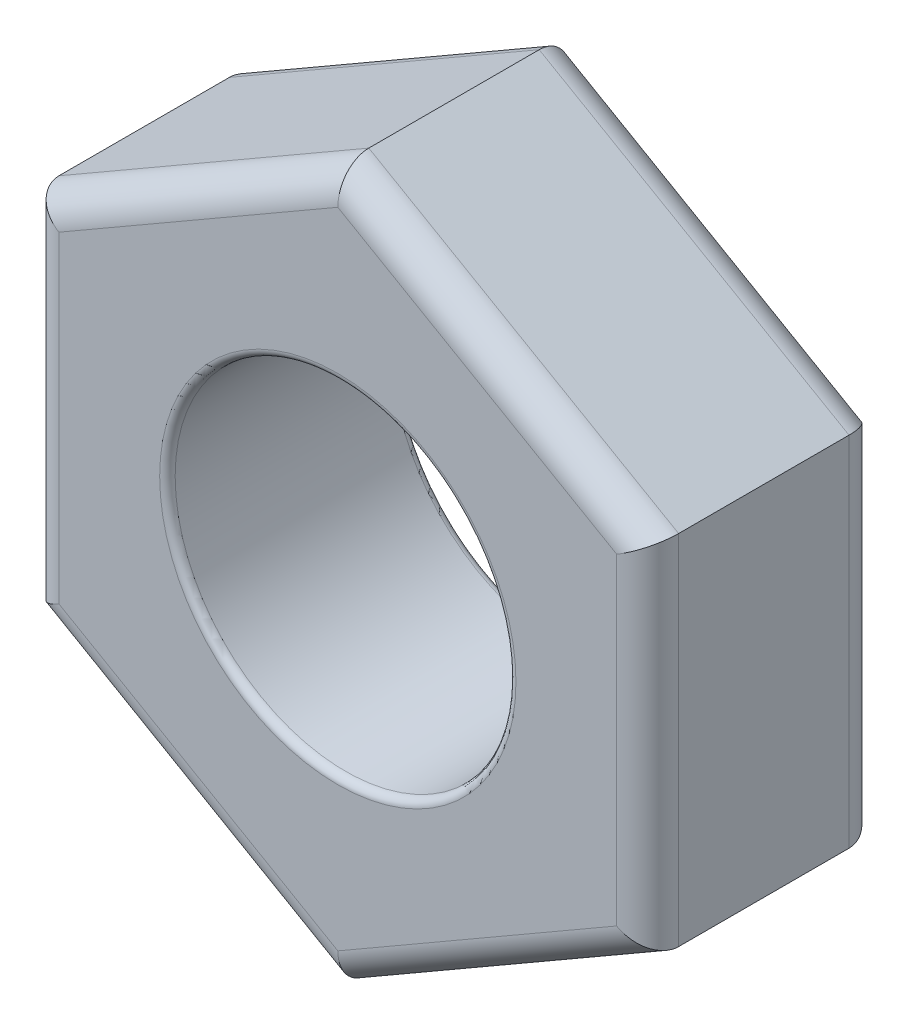
ISO-10303-21;
HEADER;
FILE_DESCRIPTION(('STEP AP214'),'2;1');
FILE_NAME('part.step','',(''),(''),'','','');
FILE_SCHEMA(('AUTOMOTIVE_DESIGN { 1 0 10303 214 1 1 1 1 }'));
ENDSEC;
DATA;
#1=APPLICATION_CONTEXT('core data for automotive mechanical design processes');
#2=APPLICATION_PROTOCOL_DEFINITION('international standard','automotive_design',2000,#1);
#3=PRODUCT_CONTEXT('',#1,'mechanical');
#4=PRODUCT('Part','Part','',(#3));
#5=PRODUCT_RELATED_PRODUCT_CATEGORY('part','',(#4));
#6=PRODUCT_DEFINITION_FORMATION('','',#4);
#7=PRODUCT_DEFINITION_CONTEXT('part definition',#1,'design');
#8=PRODUCT_DEFINITION('design','',#6,#7);
#9=PRODUCT_DEFINITION_SHAPE('','',#8);
#10=(LENGTH_UNIT() NAMED_UNIT(*) SI_UNIT(.MILLI.,.METRE.));
#11=(NAMED_UNIT(*) PLANE_ANGLE_UNIT() SI_UNIT($,.RADIAN.));
#12=(NAMED_UNIT(*) SI_UNIT($,.STERADIAN.) SOLID_ANGLE_UNIT());
#13=UNCERTAINTY_MEASURE_WITH_UNIT(LENGTH_MEASURE(1.E-05),#10,'distance_accuracy_value','');
#14=(GEOMETRIC_REPRESENTATION_CONTEXT(3) GLOBAL_UNCERTAINTY_ASSIGNED_CONTEXT((#13)) GLOBAL_UNIT_ASSIGNED_CONTEXT((#10,
#11,#12)) REPRESENTATION_CONTEXT('',''));
#15=CARTESIAN_POINT('',(0.,0.,0.));
#16=DIRECTION('',(0.,0.,1.));
#17=DIRECTION('',(1.,0.,0.));
#18=AXIS2_PLACEMENT_3D('',#15,#16,#17);
#19=CARTESIAN_POINT('',(0.,0.,15.));
#20=DIRECTION('',(0.,0.,1.));
#21=DIRECTION('',(1.,0.,0.));
#22=AXIS2_PLACEMENT_3D('',#19,#20,#21);
#23=PLANE('',#22);
#24=CARTESIAN_POINT('',(0.,0.,15.));
#25=DIRECTION('',(0.,0.,1.));
#26=DIRECTION('',(1.,0.,0.));
#27=AXIS2_PLACEMENT_3D('',#24,#25,#26);
#28=CIRCLE('',#27,11.5);
#29=CARTESIAN_POINT('',(11.5,0.,15.));
#30=VERTEX_POINT('',#29);
#31=EDGE_CURVE('E11',#30,#30,#28,.F.);
#32=ORIENTED_EDGE('',*,*,#31,.T.);
#33=EDGE_LOOP('',(#32));
#34=FACE_BOUND('',#33,.T.);
#35=DIRECTION('',(0.866025403784439,0.5,0.));
#36=VECTOR('',#35,1.);
#37=CARTESIAN_POINT('',(19.,-9.81495457622363,15.));
#38=LINE('',#37,#36);
#39=CARTESIAN_POINT('',(0.,-20.7846096908265,15.));
#40=VERTEX_POINT('',#39);
#41=CARTESIAN_POINT('',(18.,-10.3923048454133,15.));
#42=VERTEX_POINT('',#41);
#43=EDGE_CURVE('E49',#40,#42,#38,.T.);
#44=ORIENTED_EDGE('',*,*,#43,.T.);
#45=DIRECTION('',(0.,1.,0.));
#46=VECTOR('',#45,1.);
#47=CARTESIAN_POINT('',(18.,11.5470053837925,15.));
#48=LINE('',#47,#46);
#49=CARTESIAN_POINT('',(18.,10.3923048454133,15.));
#50=VERTEX_POINT('',#49);
#51=EDGE_CURVE('E129',#42,#50,#48,.T.);
#52=ORIENTED_EDGE('',*,*,#51,.T.);
#53=DIRECTION('',(-0.866025403784438,0.5,0.));
#54=VECTOR('',#53,1.);
#55=CARTESIAN_POINT('',(-0.999999999999987,21.3619599600162,15.));
#56=LINE('',#55,#54);
#57=CARTESIAN_POINT('',(0.,20.7846096908265,15.));
#58=VERTEX_POINT('',#57);
#59=EDGE_CURVE('E194',#50,#58,#56,.T.);
#60=ORIENTED_EDGE('',*,*,#59,.T.);
#61=DIRECTION('',(-0.866025403784439,-0.5,0.));
#62=VECTOR('',#61,1.);
#63=CARTESIAN_POINT('',(-19.,9.81495457622363,15.));
#64=LINE('',#63,#62);
#65=CARTESIAN_POINT('',(-18.,10.3923048454133,15.));
#66=VERTEX_POINT('',#65);
#67=EDGE_CURVE('E196',#58,#66,#64,.T.);
#68=ORIENTED_EDGE('',*,*,#67,.T.);
#69=DIRECTION('',(0.,-1.,0.));
#70=VECTOR('',#69,1.);
#71=CARTESIAN_POINT('',(-18.,-11.5470053837925,15.));
#72=LINE('',#71,#70);
#73=CARTESIAN_POINT('',(-18.,-10.3923048454133,15.));
#74=VERTEX_POINT('',#73);
#75=EDGE_CURVE('E198',#66,#74,#72,.T.);
#76=ORIENTED_EDGE('',*,*,#75,.T.);
#77=DIRECTION('',(0.866025403784439,-0.5,0.));
#78=VECTOR('',#77,1.);
#79=CARTESIAN_POINT('',(0.999999999999984,-21.3619599600162,15.));
#80=LINE('',#79,#78);
#81=EDGE_CURVE('E54',#74,#40,#80,.T.);
#82=ORIENTED_EDGE('',*,*,#81,.T.);
#83=EDGE_LOOP('',(#44,#52,#60,#68,#76,#82));
#84=FACE_BOUND('',#83,.T.);
#85=ADVANCED_FACE('F34',(#34,#84),#23,.T.);
#86=CARTESIAN_POINT('',(0.,0.,0.));
#87=DIRECTION('',(0.,0.,1.));
#88=DIRECTION('',(1.,0.,0.));
#89=AXIS2_PLACEMENT_3D('',#86,#87,#88);
#90=PLANE('',#89);
#91=CARTESIAN_POINT('',(0.,0.,0.));
#92=DIRECTION('',(0.,0.,1.));
#93=DIRECTION('',(1.,0.,0.));
#94=AXIS2_PLACEMENT_3D('',#91,#92,#93);
#95=CIRCLE('',#94,11.5);
#96=CARTESIAN_POINT('',(11.5,0.,0.));
#97=VERTEX_POINT('',#96);
#98=EDGE_CURVE('E203',#97,#97,#95,.T.);
#99=ORIENTED_EDGE('',*,*,#98,.T.);
#100=EDGE_LOOP('',(#99));
#101=FACE_BOUND('',#100,.T.);
#102=DIRECTION('',(0.,1.,0.));
#103=VECTOR('',#102,1.);
#104=CARTESIAN_POINT('',(18.,0.,0.));
#105=LINE('',#104,#103);
#106=CARTESIAN_POINT('',(18.,10.3923048454133,0.));
#107=VERTEX_POINT('',#106);
#108=CARTESIAN_POINT('',(18.,-10.3923048454133,0.));
#109=VERTEX_POINT('',#108);
#110=EDGE_CURVE('E165',#107,#109,#105,.F.);
#111=ORIENTED_EDGE('',*,*,#110,.T.);
#112=DIRECTION('',(0.866025403784439,0.5,0.));
#113=VECTOR('',#112,1.);
#114=CARTESIAN_POINT('',(9.00000000000001,-15.5884572681199,0.));
#115=LINE('',#114,#113);
#116=CARTESIAN_POINT('',(0.,-20.7846096908265,0.));
#117=VERTEX_POINT('',#116);
#118=EDGE_CURVE('E175',#109,#117,#115,.F.);
#119=ORIENTED_EDGE('',*,*,#118,.T.);
#120=DIRECTION('',(0.866025403784439,-0.5,0.));
#121=VECTOR('',#120,1.);
#122=CARTESIAN_POINT('',(-9.00000000000001,-15.5884572681199,0.));
#123=LINE('',#122,#121);
#124=CARTESIAN_POINT('',(-18.,-10.3923048454133,0.));
#125=VERTEX_POINT('',#124);
#126=EDGE_CURVE('E173',#117,#125,#123,.F.);
#127=ORIENTED_EDGE('',*,*,#126,.T.);
#128=DIRECTION('',(0.,-1.,0.));
#129=VECTOR('',#128,1.);
#130=CARTESIAN_POINT('',(-18.,0.,0.));
#131=LINE('',#130,#129);
#132=CARTESIAN_POINT('',(-18.,10.3923048454133,0.));
#133=VERTEX_POINT('',#132);
#134=EDGE_CURVE('E171',#125,#133,#131,.F.);
#135=ORIENTED_EDGE('',*,*,#134,.T.);
#136=DIRECTION('',(-0.866025403784439,-0.5,0.));
#137=VECTOR('',#136,1.);
#138=CARTESIAN_POINT('',(-9.00000000000001,15.5884572681199,0.));
#139=LINE('',#138,#137);
#140=CARTESIAN_POINT('',(0.,20.7846096908265,0.));
#141=VERTEX_POINT('',#140);
#142=EDGE_CURVE('E169',#133,#141,#139,.F.);
#143=ORIENTED_EDGE('',*,*,#142,.T.);
#144=DIRECTION('',(-0.866025403784438,0.5,0.));
#145=VECTOR('',#144,1.);
#146=CARTESIAN_POINT('',(9.00000000000001,15.5884572681199,0.));
#147=LINE('',#146,#145);
#148=EDGE_CURVE('E167',#141,#107,#147,.F.);
#149=ORIENTED_EDGE('',*,*,#148,.T.);
#150=EDGE_LOOP('',(#111,#119,#127,#135,#143,#149));
#151=FACE_BOUND('',#150,.T.);
#152=ADVANCED_FACE('F246',(#101,#151),#90,.F.);
#153=CARTESIAN_POINT('',(-20.,-11.5470053837925,15.));
#154=DIRECTION('',(0.5,0.866025403784439,0.));
#155=DIRECTION('',(-0.866025403784439,0.5,0.));
#156=AXIS2_PLACEMENT_3D('',#153,#154,#155);
#157=PLANE('',#156);
#158=DIRECTION('',(0.,0.,-1.));
#159=VECTOR('',#158,1.);
#160=CARTESIAN_POINT('',(-20.,-11.5470053837925,15.));
#161=LINE('',#160,#159);
#162=CARTESIAN_POINT('',(-20.,-11.5470053837925,13.));
#163=VERTEX_POINT('',#162);
#164=CARTESIAN_POINT('',(-20.,-11.5470053837925,2.));
#165=VERTEX_POINT('',#164);
#166=EDGE_CURVE('E221',#163,#165,#161,.T.);
#167=ORIENTED_EDGE('',*,*,#166,.T.);
#168=DIRECTION('',(0.866025403784439,-0.5,0.));
#169=VECTOR('',#168,1.);
#170=CARTESIAN_POINT('',(-20.,-11.5470053837925,2.));
#171=LINE('',#170,#169);
#172=CARTESIAN_POINT('',(0.,-23.094010767585,2.));
#173=VERTEX_POINT('',#172);
#174=EDGE_CURVE('E180',#165,#173,#171,.T.);
#175=ORIENTED_EDGE('',*,*,#174,.T.);
#176=DIRECTION('',(0.,0.,-1.));
#177=VECTOR('',#176,1.);
#178=CARTESIAN_POINT('',(0.,-23.094010767585,15.));
#179=LINE('',#178,#177);
#180=CARTESIAN_POINT('',(0.,-23.094010767585,13.));
#181=VERTEX_POINT('',#180);
#182=EDGE_CURVE('E143',#181,#173,#179,.T.);
#183=ORIENTED_EDGE('',*,*,#182,.F.);
#184=DIRECTION('',(0.866025403784439,-0.5,0.));
#185=VECTOR('',#184,1.);
#186=CARTESIAN_POINT('',(-20.,-11.5470053837925,13.));
#187=LINE('',#186,#185);
#188=EDGE_CURVE('E178',#181,#163,#187,.F.);
#189=ORIENTED_EDGE('',*,*,#188,.T.);
#190=EDGE_LOOP('',(#167,#175,#183,#189));
#191=FACE_BOUND('',#190,.T.);
#192=ADVANCED_FACE('F249',(#191),#157,.F.);
#193=CARTESIAN_POINT('',(0.,-23.094010767585,15.));
#194=DIRECTION('',(-0.5,0.866025403784438,0.));
#195=DIRECTION('',(-0.866025403784439,-0.5,0.));
#196=AXIS2_PLACEMENT_3D('',#193,#194,#195);
#197=PLANE('',#196);
#198=ORIENTED_EDGE('',*,*,#182,.T.);
#199=DIRECTION('',(0.866025403784439,0.5,0.));
#200=VECTOR('',#199,1.);
#201=CARTESIAN_POINT('',(0.,-23.094010767585,2.));
#202=LINE('',#201,#200);
#203=CARTESIAN_POINT('',(20.,-11.5470053837925,2.));
#204=VERTEX_POINT('',#203);
#205=EDGE_CURVE('E142',#173,#204,#202,.T.);
#206=ORIENTED_EDGE('',*,*,#205,.T.);
#207=DIRECTION('',(0.,0.,-1.));
#208=VECTOR('',#207,1.);
#209=CARTESIAN_POINT('',(20.,-11.5470053837925,15.));
#210=LINE('',#209,#208);
#211=CARTESIAN_POINT('',(20.,-11.5470053837925,13.));
#212=VERTEX_POINT('',#211);
#213=EDGE_CURVE('E149',#212,#204,#210,.T.);
#214=ORIENTED_EDGE('',*,*,#213,.F.);
#215=DIRECTION('',(0.866025403784439,0.5,0.));
#216=VECTOR('',#215,1.);
#217=CARTESIAN_POINT('',(0.,-23.094010767585,13.));
#218=LINE('',#217,#216);
#219=EDGE_CURVE('E135',#212,#181,#218,.F.);
#220=ORIENTED_EDGE('',*,*,#219,.T.);
#221=EDGE_LOOP('',(#198,#206,#214,#220));
#222=FACE_BOUND('',#221,.T.);
#223=ADVANCED_FACE('F156',(#222),#197,.F.);
#224=CARTESIAN_POINT('',(20.,-11.5470053837925,15.));
#225=DIRECTION('',(-1.,0.,0.));
#226=DIRECTION('',(0.,-1.,0.));
#227=AXIS2_PLACEMENT_3D('',#224,#225,#226);
#228=PLANE('',#227);
#229=ORIENTED_EDGE('',*,*,#213,.T.);
#230=DIRECTION('',(0.,1.,0.));
#231=VECTOR('',#230,1.);
#232=CARTESIAN_POINT('',(20.,-11.5470053837925,2.));
#233=LINE('',#232,#231);
#234=CARTESIAN_POINT('',(20.,11.5470053837925,2.));
#235=VERTEX_POINT('',#234);
#236=EDGE_CURVE('E152',#204,#235,#233,.T.);
#237=ORIENTED_EDGE('',*,*,#236,.T.);
#238=DIRECTION('',(0.,0.,-1.));
#239=VECTOR('',#238,1.);
#240=CARTESIAN_POINT('',(20.,11.5470053837925,15.));
#241=LINE('',#240,#239);
#242=CARTESIAN_POINT('',(20.,11.5470053837925,13.));
#243=VERTEX_POINT('',#242);
#244=EDGE_CURVE('E151',#243,#235,#241,.T.);
#245=ORIENTED_EDGE('',*,*,#244,.F.);
#246=DIRECTION('',(0.,1.,0.));
#247=VECTOR('',#246,1.);
#248=CARTESIAN_POINT('',(20.,-11.5470053837925,13.));
#249=LINE('',#248,#247);
#250=EDGE_CURVE('E127',#243,#212,#249,.F.);
#251=ORIENTED_EDGE('',*,*,#250,.T.);
#252=EDGE_LOOP('',(#229,#237,#245,#251));
#253=FACE_BOUND('',#252,.T.);
#254=ADVANCED_FACE('F148',(#253),#228,.F.);
#255=CARTESIAN_POINT('',(20.,11.5470053837925,15.));
#256=DIRECTION('',(-0.5,-0.866025403784438,0.));
#257=DIRECTION('',(0.866025403784438,-0.5,0.));
#258=AXIS2_PLACEMENT_3D('',#255,#256,#257);
#259=PLANE('',#258);
#260=ORIENTED_EDGE('',*,*,#244,.T.);
#261=DIRECTION('',(-0.866025403784438,0.5,0.));
#262=VECTOR('',#261,1.);
#263=CARTESIAN_POINT('',(20.,11.5470053837925,2.));
#264=LINE('',#263,#262);
#265=CARTESIAN_POINT('',(0.,23.0940107675851,2.));
#266=VERTEX_POINT('',#265);
#267=EDGE_CURVE('E153',#235,#266,#264,.T.);
#268=ORIENTED_EDGE('',*,*,#267,.T.);
#269=DIRECTION('',(0.,0.,-1.));
#270=VECTOR('',#269,1.);
#271=CARTESIAN_POINT('',(0.,23.0940107675851,15.));
#272=LINE('',#271,#270);
#273=CARTESIAN_POINT('',(0.,23.0940107675851,13.));
#274=VERTEX_POINT('',#273);
#275=EDGE_CURVE('E160',#274,#266,#272,.T.);
#276=ORIENTED_EDGE('',*,*,#275,.F.);
#277=DIRECTION('',(-0.866025403784438,0.5,0.));
#278=VECTOR('',#277,1.);
#279=CARTESIAN_POINT('',(20.,11.5470053837925,13.));
#280=LINE('',#279,#278);
#281=EDGE_CURVE('E190',#274,#243,#280,.F.);
#282=ORIENTED_EDGE('',*,*,#281,.T.);
#283=EDGE_LOOP('',(#260,#268,#276,#282));
#284=FACE_BOUND('',#283,.T.);
#285=ADVANCED_FACE('F265',(#284),#259,.F.);
#286=CARTESIAN_POINT('',(0.,23.0940107675851,15.));
#287=DIRECTION('',(0.5,-0.866025403784439,0.));
#288=DIRECTION('',(0.866025403784439,0.5,0.));
#289=AXIS2_PLACEMENT_3D('',#286,#287,#288);
#290=PLANE('',#289);
#291=ORIENTED_EDGE('',*,*,#275,.T.);
#292=DIRECTION('',(-0.866025403784439,-0.5,0.));
#293=VECTOR('',#292,1.);
#294=CARTESIAN_POINT('',(0.,23.0940107675851,2.));
#295=LINE('',#294,#293);
#296=CARTESIAN_POINT('',(-20.,11.5470053837925,2.));
#297=VERTEX_POINT('',#296);
#298=EDGE_CURVE('E188',#266,#297,#295,.T.);
#299=ORIENTED_EDGE('',*,*,#298,.T.);
#300=DIRECTION('',(0.,0.,-1.));
#301=VECTOR('',#300,1.);
#302=CARTESIAN_POINT('',(-20.,11.5470053837925,15.));
#303=LINE('',#302,#301);
#304=CARTESIAN_POINT('',(-20.,11.5470053837925,13.));
#305=VERTEX_POINT('',#304);
#306=EDGE_CURVE('E282',#305,#297,#303,.T.);
#307=ORIENTED_EDGE('',*,*,#306,.F.);
#308=DIRECTION('',(-0.866025403784439,-0.5,0.));
#309=VECTOR('',#308,1.);
#310=CARTESIAN_POINT('',(0.,23.0940107675851,13.));
#311=LINE('',#310,#309);
#312=EDGE_CURVE('E186',#305,#274,#311,.F.);
#313=ORIENTED_EDGE('',*,*,#312,.T.);
#314=EDGE_LOOP('',(#291,#299,#307,#313));
#315=FACE_BOUND('',#314,.T.);
#316=ADVANCED_FACE('F281',(#315),#290,.F.);
#317=CARTESIAN_POINT('',(-20.,11.5470053837925,15.));
#318=DIRECTION('',(1.,0.,0.));
#319=DIRECTION('',(0.,0.,-1.));
#320=AXIS2_PLACEMENT_3D('',#317,#318,#319);
#321=PLANE('',#320);
#322=ORIENTED_EDGE('',*,*,#306,.T.);
#323=DIRECTION('',(0.,-1.,0.));
#324=VECTOR('',#323,1.);
#325=CARTESIAN_POINT('',(-20.,11.5470053837925,2.));
#326=LINE('',#325,#324);
#327=EDGE_CURVE('E184',#297,#165,#326,.T.);
#328=ORIENTED_EDGE('',*,*,#327,.T.);
#329=ORIENTED_EDGE('',*,*,#166,.F.);
#330=DIRECTION('',(0.,-1.,0.));
#331=VECTOR('',#330,1.);
#332=CARTESIAN_POINT('',(-20.,11.5470053837925,13.));
#333=LINE('',#332,#331);
#334=EDGE_CURVE('E182',#163,#305,#333,.F.);
#335=ORIENTED_EDGE('',*,*,#334,.T.);
#336=EDGE_LOOP('',(#322,#328,#329,#335));
#337=FACE_BOUND('',#336,.T.);
#338=ADVANCED_FACE('F285',(#337),#321,.F.);
#339=CARTESIAN_POINT('',(0.,0.,15.));
#340=DIRECTION('',(0.,0.,-1.));
#341=DIRECTION('',(-1.,0.,0.));
#342=AXIS2_PLACEMENT_3D('',#339,#340,#341);
#343=CYLINDRICAL_SURFACE('',#342,11.);
#344=CARTESIAN_POINT('',(0.,0.,0.5));
#345=DIRECTION('',(0.,0.,1.));
#346=DIRECTION('',(1.,0.,0.));
#347=AXIS2_PLACEMENT_3D('',#344,#345,#346);
#348=CIRCLE('',#347,11.);
#349=CARTESIAN_POINT('',(11.,0.,0.5));
#350=VERTEX_POINT('',#349);
#351=EDGE_CURVE('E42',#350,#350,#348,.F.);
#352=ORIENTED_EDGE('',*,*,#351,.T.);
#353=EDGE_LOOP('',(#352));
#354=FACE_BOUND('',#353,.T.);
#355=CARTESIAN_POINT('',(0.,0.,14.5));
#356=DIRECTION('',(0.,0.,1.));
#357=DIRECTION('',(1.,0.,0.));
#358=AXIS2_PLACEMENT_3D('',#355,#356,#357);
#359=CIRCLE('',#358,11.);
#360=CARTESIAN_POINT('',(11.,0.,14.5));
#361=VERTEX_POINT('',#360);
#362=EDGE_CURVE('E233',#361,#361,#359,.T.);
#363=ORIENTED_EDGE('',*,*,#362,.T.);
#364=EDGE_LOOP('',(#363));
#365=FACE_BOUND('',#364,.T.);
#366=ADVANCED_FACE('F238',(#354,#365),#343,.F.);
#367=CARTESIAN_POINT('',(1.00000000000001,21.3619599600162,2.));
#368=DIRECTION('',(-0.866025403784439,-0.5,0.));
#369=DIRECTION('',(0.5,-0.866025403784439,0.));
#370=AXIS2_PLACEMENT_3D('',#367,#368,#369);
#371=CYLINDRICAL_SURFACE('',#370,2.);
#372=CARTESIAN_POINT('',(0.,20.7846096908265,2.));
#373=DIRECTION('',(-1.,0.,0.));
#374=DIRECTION('',(0.,1.,0.));
#375=AXIS2_PLACEMENT_3D('',#372,#373,#374);
#376=ELLIPSE('',#375,2.3094010767585,2.);
#377=EDGE_CURVE('E215',#141,#266,#376,.F.);
#378=ORIENTED_EDGE('',*,*,#377,.F.);
#379=ORIENTED_EDGE('',*,*,#142,.F.);
#380=CARTESIAN_POINT('',(-18.,10.3923048454133,2.));
#381=DIRECTION('',(-0.5,-0.866025403784439,0.));
#382=DIRECTION('',(-0.866025403784439,0.5,0.));
#383=AXIS2_PLACEMENT_3D('',#380,#381,#382);
#384=ELLIPSE('',#383,2.3094010767585,2.);
#385=EDGE_CURVE('E218',#297,#133,#384,.T.);
#386=ORIENTED_EDGE('',*,*,#385,.F.);
#387=ORIENTED_EDGE('',*,*,#298,.F.);
#388=EDGE_LOOP('',(#378,#379,#386,#387));
#389=FACE_BOUND('',#388,.T.);
#390=ADVANCED_FACE('F275',(#389),#371,.T.);
#391=CARTESIAN_POINT('',(-18.,11.5470053837925,2.));
#392=DIRECTION('',(0.,-1.,0.));
#393=DIRECTION('',(0.,0.,-1.));
#394=AXIS2_PLACEMENT_3D('',#391,#392,#393);
#395=CYLINDRICAL_SURFACE('',#394,2.);
#396=ORIENTED_EDGE('',*,*,#385,.T.);
#397=ORIENTED_EDGE('',*,*,#134,.F.);
#398=CARTESIAN_POINT('',(-18.,-10.3923048454133,2.));
#399=DIRECTION('',(0.5,-0.866025403784439,0.));
#400=DIRECTION('',(-0.866025403784439,-0.5,0.));
#401=AXIS2_PLACEMENT_3D('',#398,#399,#400);
#402=ELLIPSE('',#401,2.3094010767585,2.);
#403=EDGE_CURVE('E212',#165,#125,#402,.T.);
#404=ORIENTED_EDGE('',*,*,#403,.F.);
#405=ORIENTED_EDGE('',*,*,#327,.F.);
#406=EDGE_LOOP('',(#396,#397,#404,#405));
#407=FACE_BOUND('',#406,.T.);
#408=ADVANCED_FACE('F297',(#407),#395,.T.);
#409=CARTESIAN_POINT('',(19.,9.81495457622366,2.));
#410=DIRECTION('',(-0.866025403784438,0.5,0.));
#411=DIRECTION('',(-0.5,-0.866025403784438,0.));
#412=AXIS2_PLACEMENT_3D('',#409,#410,#411);
#413=CYLINDRICAL_SURFACE('',#412,2.);
#414=ORIENTED_EDGE('',*,*,#377,.T.);
#415=ORIENTED_EDGE('',*,*,#267,.F.);
#416=CARTESIAN_POINT('',(18.,10.3923048454133,2.));
#417=DIRECTION('',(-0.5,0.866025403784439,0.));
#418=DIRECTION('',(0.866025403784439,0.5,0.));
#419=AXIS2_PLACEMENT_3D('',#416,#417,#418);
#420=ELLIPSE('',#419,2.3094010767585,2.);
#421=EDGE_CURVE('E209',#107,#235,#420,.F.);
#422=ORIENTED_EDGE('',*,*,#421,.F.);
#423=ORIENTED_EDGE('',*,*,#148,.F.);
#424=EDGE_LOOP('',(#414,#415,#422,#423));
#425=FACE_BOUND('',#424,.T.);
#426=ADVANCED_FACE('F270',(#425),#413,.T.);
#427=CARTESIAN_POINT('',(-19.,-9.81495457622364,2.));
#428=DIRECTION('',(0.866025403784439,-0.5,0.));
#429=DIRECTION('',(0.5,0.866025403784439,0.));
#430=AXIS2_PLACEMENT_3D('',#427,#428,#429);
#431=CYLINDRICAL_SURFACE('',#430,2.);
#432=ORIENTED_EDGE('',*,*,#403,.T.);
#433=ORIENTED_EDGE('',*,*,#126,.F.);
#434=CARTESIAN_POINT('',(0.,-20.7846096908265,2.));
#435=DIRECTION('',(1.,0.,0.));
#436=DIRECTION('',(0.,-1.,0.));
#437=AXIS2_PLACEMENT_3D('',#434,#435,#436);
#438=ELLIPSE('',#437,2.3094010767585,2.);
#439=EDGE_CURVE('E206',#173,#117,#438,.T.);
#440=ORIENTED_EDGE('',*,*,#439,.F.);
#441=ORIENTED_EDGE('',*,*,#174,.F.);
#442=EDGE_LOOP('',(#432,#433,#440,#441));
#443=FACE_BOUND('',#442,.T.);
#444=ADVANCED_FACE('F299',(#443),#431,.T.);
#445=CARTESIAN_POINT('',(18.,-11.5470053837925,2.));
#446=DIRECTION('',(0.,1.,0.));
#447=DIRECTION('',(-1.,0.,0.));
#448=AXIS2_PLACEMENT_3D('',#445,#446,#447);
#449=CYLINDRICAL_SURFACE('',#448,2.);
#450=ORIENTED_EDGE('',*,*,#421,.T.);
#451=ORIENTED_EDGE('',*,*,#236,.F.);
#452=CARTESIAN_POINT('',(18.,-10.3923048454133,2.));
#453=DIRECTION('',(0.5,0.866025403784439,0.));
#454=DIRECTION('',(-0.866025403784439,0.5,0.));
#455=AXIS2_PLACEMENT_3D('',#452,#453,#454);
#456=ELLIPSE('',#455,2.3094010767585,2.);
#457=EDGE_CURVE('E204',#109,#204,#456,.F.);
#458=ORIENTED_EDGE('',*,*,#457,.F.);
#459=ORIENTED_EDGE('',*,*,#110,.F.);
#460=EDGE_LOOP('',(#450,#451,#458,#459));
#461=FACE_BOUND('',#460,.T.);
#462=ADVANCED_FACE('F262',(#461),#449,.T.);
#463=CARTESIAN_POINT('',(-1.00000000000002,-21.3619599600162,2.));
#464=DIRECTION('',(0.866025403784439,0.5,0.));
#465=DIRECTION('',(-0.5,0.866025403784438,0.));
#466=AXIS2_PLACEMENT_3D('',#463,#464,#465);
#467=CYLINDRICAL_SURFACE('',#466,2.);
#468=ORIENTED_EDGE('',*,*,#439,.T.);
#469=ORIENTED_EDGE('',*,*,#118,.F.);
#470=ORIENTED_EDGE('',*,*,#457,.T.);
#471=ORIENTED_EDGE('',*,*,#205,.F.);
#472=EDGE_LOOP('',(#468,#469,#470,#471));
#473=FACE_BOUND('',#472,.T.);
#474=ADVANCED_FACE('F258',(#473),#467,.T.);
#475=CARTESIAN_POINT('',(-18.,0.,13.));
#476=DIRECTION('',(0.,1.,0.));
#477=DIRECTION('',(0.,0.,1.));
#478=AXIS2_PLACEMENT_3D('',#475,#476,#477);
#479=CYLINDRICAL_SURFACE('',#478,2.);
#480=CARTESIAN_POINT('',(-18.,10.3923048454133,13.));
#481=DIRECTION('',(0.5,0.866025403784439,0.));
#482=DIRECTION('',(0.866025403784439,-0.5,0.));
#483=AXIS2_PLACEMENT_3D('',#480,#481,#482);
#484=ELLIPSE('',#483,2.3094010767585,2.);
#485=EDGE_CURVE('E226',#305,#66,#484,.T.);
#486=ORIENTED_EDGE('',*,*,#485,.F.);
#487=ORIENTED_EDGE('',*,*,#334,.F.);
#488=CARTESIAN_POINT('',(-18.,-10.3923048454133,13.));
#489=DIRECTION('',(-0.5,0.866025403784439,0.));
#490=DIRECTION('',(0.866025403784439,0.5,0.));
#491=AXIS2_PLACEMENT_3D('',#488,#489,#490);
#492=ELLIPSE('',#491,2.3094010767585,2.);
#493=EDGE_CURVE('E207',#74,#163,#492,.F.);
#494=ORIENTED_EDGE('',*,*,#493,.F.);
#495=ORIENTED_EDGE('',*,*,#75,.F.);
#496=EDGE_LOOP('',(#486,#487,#494,#495));
#497=FACE_BOUND('',#496,.T.);
#498=ADVANCED_FACE('F328',(#497),#479,.T.);
#499=CARTESIAN_POINT('',(-9.00000000000001,-15.5884572681199,13.));
#500=DIRECTION('',(-0.866025403784439,0.5,0.));
#501=DIRECTION('',(-0.5,-0.866025403784439,0.));
#502=AXIS2_PLACEMENT_3D('',#499,#500,#501);
#503=CYLINDRICAL_SURFACE('',#502,2.);
#504=ORIENTED_EDGE('',*,*,#493,.T.);
#505=ORIENTED_EDGE('',*,*,#188,.F.);
#506=CARTESIAN_POINT('',(0.,-20.7846096908265,13.));
#507=DIRECTION('',(-1.,0.,0.));
#508=DIRECTION('',(0.,1.,0.));
#509=AXIS2_PLACEMENT_3D('',#506,#507,#508);
#510=ELLIPSE('',#509,2.3094010767585,2.);
#511=EDGE_CURVE('E137',#40,#181,#510,.F.);
#512=ORIENTED_EDGE('',*,*,#511,.F.);
#513=ORIENTED_EDGE('',*,*,#81,.F.);
#514=EDGE_LOOP('',(#504,#505,#512,#513));
#515=FACE_BOUND('',#514,.T.);
#516=ADVANCED_FACE('F332',(#515),#503,.T.);
#517=CARTESIAN_POINT('',(-9.00000000000001,15.5884572681199,13.));
#518=DIRECTION('',(0.866025403784439,0.5,0.));
#519=DIRECTION('',(-0.5,0.866025403784439,0.));
#520=AXIS2_PLACEMENT_3D('',#517,#518,#519);
#521=CYLINDRICAL_SURFACE('',#520,2.);
#522=ORIENTED_EDGE('',*,*,#485,.T.);
#523=ORIENTED_EDGE('',*,*,#67,.F.);
#524=CARTESIAN_POINT('',(0.,20.7846096908265,13.));
#525=DIRECTION('',(1.,0.,0.));
#526=DIRECTION('',(0.,-1.,0.));
#527=AXIS2_PLACEMENT_3D('',#524,#525,#526);
#528=ELLIPSE('',#527,2.3094010767585,2.);
#529=EDGE_CURVE('E131',#274,#58,#528,.T.);
#530=ORIENTED_EDGE('',*,*,#529,.F.);
#531=ORIENTED_EDGE('',*,*,#312,.F.);
#532=EDGE_LOOP('',(#522,#523,#530,#531));
#533=FACE_BOUND('',#532,.T.);
#534=ADVANCED_FACE('F338',(#533),#521,.T.);
#535=CARTESIAN_POINT('',(9.00000000000001,-15.5884572681199,13.));
#536=DIRECTION('',(-0.866025403784439,-0.5,0.));
#537=DIRECTION('',(0.5,-0.866025403784438,0.));
#538=AXIS2_PLACEMENT_3D('',#535,#536,#537);
#539=CYLINDRICAL_SURFACE('',#538,2.);
#540=ORIENTED_EDGE('',*,*,#511,.T.);
#541=ORIENTED_EDGE('',*,*,#219,.F.);
#542=CARTESIAN_POINT('',(18.,-10.3923048454133,13.));
#543=DIRECTION('',(-0.5,-0.866025403784439,0.));
#544=DIRECTION('',(-0.866025403784439,0.5,0.));
#545=AXIS2_PLACEMENT_3D('',#542,#543,#544);
#546=ELLIPSE('',#545,2.3094010767585,2.);
#547=EDGE_CURVE('E123',#42,#212,#546,.F.);
#548=ORIENTED_EDGE('',*,*,#547,.F.);
#549=ORIENTED_EDGE('',*,*,#43,.F.);
#550=EDGE_LOOP('',(#540,#541,#548,#549));
#551=FACE_BOUND('',#550,.T.);
#552=ADVANCED_FACE('F136',(#551),#539,.T.);
#553=CARTESIAN_POINT('',(9.00000000000001,15.5884572681199,13.));
#554=DIRECTION('',(0.866025403784438,-0.5,0.));
#555=DIRECTION('',(0.5,0.866025403784438,0.));
#556=AXIS2_PLACEMENT_3D('',#553,#554,#555);
#557=CYLINDRICAL_SURFACE('',#556,2.);
#558=ORIENTED_EDGE('',*,*,#529,.T.);
#559=ORIENTED_EDGE('',*,*,#59,.F.);
#560=CARTESIAN_POINT('',(18.,10.3923048454133,13.));
#561=DIRECTION('',(0.5,-0.866025403784439,0.));
#562=DIRECTION('',(0.866025403784439,0.5,0.));
#563=AXIS2_PLACEMENT_3D('',#560,#561,#562);
#564=ELLIPSE('',#563,2.3094010767585,2.);
#565=EDGE_CURVE('E132',#243,#50,#564,.T.);
#566=ORIENTED_EDGE('',*,*,#565,.F.);
#567=ORIENTED_EDGE('',*,*,#281,.F.);
#568=EDGE_LOOP('',(#558,#559,#566,#567));
#569=FACE_BOUND('',#568,.T.);
#570=ADVANCED_FACE('F347',(#569),#557,.T.);
#571=CARTESIAN_POINT('',(18.,0.,13.));
#572=DIRECTION('',(0.,-1.,0.));
#573=DIRECTION('',(1.,0.,0.));
#574=AXIS2_PLACEMENT_3D('',#571,#572,#573);
#575=CYLINDRICAL_SURFACE('',#574,2.);
#576=ORIENTED_EDGE('',*,*,#547,.T.);
#577=ORIENTED_EDGE('',*,*,#250,.F.);
#578=ORIENTED_EDGE('',*,*,#565,.T.);
#579=ORIENTED_EDGE('',*,*,#51,.F.);
#580=EDGE_LOOP('',(#576,#577,#578,#579));
#581=FACE_BOUND('',#580,.T.);
#582=ADVANCED_FACE('F125',(#581),#575,.T.);
#583=CARTESIAN_POINT('',(0.,0.,0.5));
#584=DIRECTION('',(0.,0.,1.));
#585=DIRECTION('',(1.,0.,0.));
#586=AXIS2_PLACEMENT_3D('',#583,#584,#585);
#587=TOROIDAL_SURFACE('',#586,11.5,0.5);
#588=ORIENTED_EDGE('',*,*,#351,.F.);
#589=EDGE_LOOP('',(#588));
#590=FACE_BOUND('',#589,.T.);
#591=ORIENTED_EDGE('',*,*,#98,.F.);
#592=EDGE_LOOP('',(#591));
#593=FACE_BOUND('',#592,.T.);
#594=ADVANCED_FACE('F241',(#590,#593),#587,.T.);
#595=CARTESIAN_POINT('',(0.,0.,14.5));
#596=DIRECTION('',(0.,0.,1.));
#597=DIRECTION('',(1.,0.,0.));
#598=AXIS2_PLACEMENT_3D('',#595,#596,#597);
#599=TOROIDAL_SURFACE('',#598,11.5,0.5);
#600=ORIENTED_EDGE('',*,*,#31,.F.);
#601=EDGE_LOOP('',(#600));
#602=FACE_BOUND('',#601,.T.);
#603=ORIENTED_EDGE('',*,*,#362,.F.);
#604=EDGE_LOOP('',(#603));
#605=FACE_BOUND('',#604,.T.);
#606=ADVANCED_FACE('F36',(#602,#605),#599,.T.);
#607=CLOSED_SHELL('',(#85,#152,#192,#223,#254,#285,#316,#338,#366,#390,#408,#426,#444,#462,#474,
#498,#516,#534,#552,#570,#582,#594,#606));
#608=MANIFOLD_SOLID_BREP('B2',#607);
#609=ADVANCED_BREP_SHAPE_REPRESENTATION('',(#18,#608),#14);
#610=SHAPE_DEFINITION_REPRESENTATION(#9,#609);
ENDSEC;
END-ISO-10303-21;
